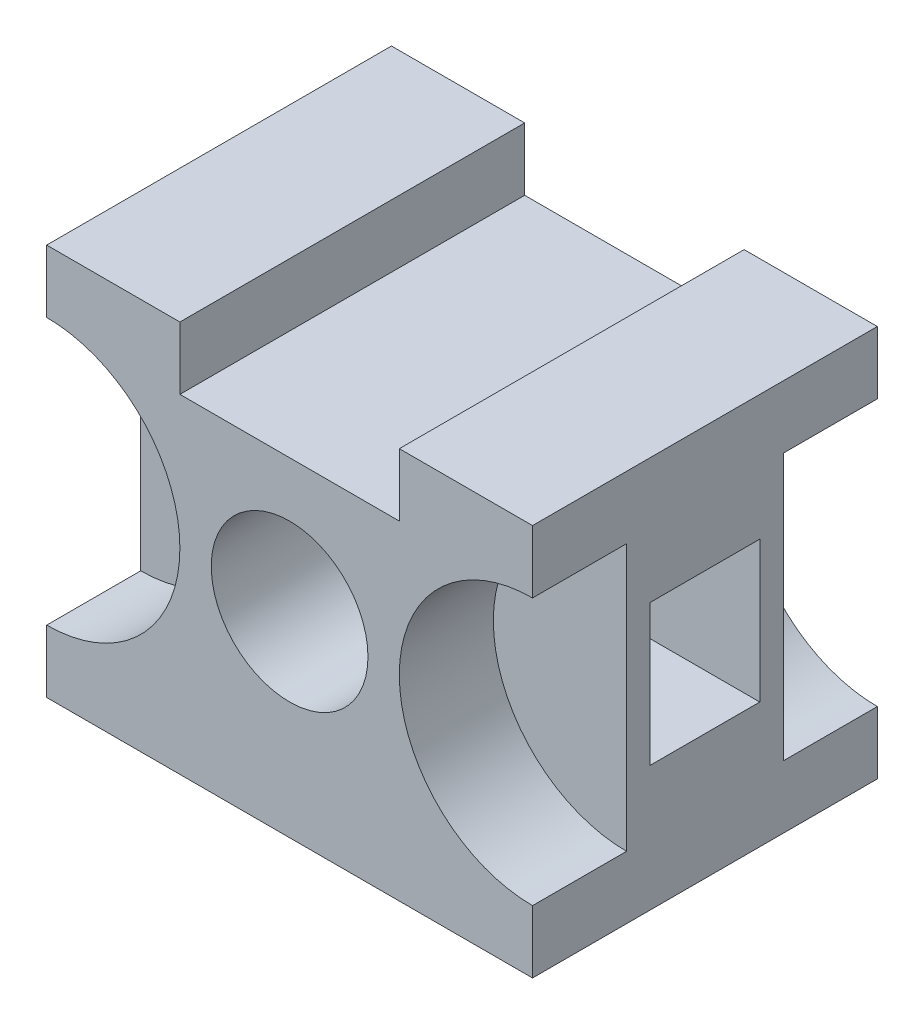
ISO-10303-21;
HEADER;
FILE_DESCRIPTION(('STEP AP214'),'2;1');
FILE_NAME('part.step','',(''),(''),'','','');
FILE_SCHEMA(('AUTOMOTIVE_DESIGN { 1 0 10303 214 1 1 1 1 }'));
ENDSEC;
DATA;
#1=APPLICATION_CONTEXT('core data for automotive mechanical design processes');
#2=APPLICATION_PROTOCOL_DEFINITION('international standard','automotive_design',2000,#1);
#3=PRODUCT_CONTEXT('',#1,'mechanical');
#4=PRODUCT('Part','Part','',(#3));
#5=PRODUCT_RELATED_PRODUCT_CATEGORY('part','',(#4));
#6=PRODUCT_DEFINITION_FORMATION('','',#4);
#7=PRODUCT_DEFINITION_CONTEXT('part definition',#1,'design');
#8=PRODUCT_DEFINITION('design','',#6,#7);
#9=PRODUCT_DEFINITION_SHAPE('','',#8);
#10=(LENGTH_UNIT() NAMED_UNIT(*) SI_UNIT(.MILLI.,.METRE.));
#11=(NAMED_UNIT(*) PLANE_ANGLE_UNIT() SI_UNIT($,.RADIAN.));
#12=(NAMED_UNIT(*) SI_UNIT($,.STERADIAN.) SOLID_ANGLE_UNIT());
#13=UNCERTAINTY_MEASURE_WITH_UNIT(LENGTH_MEASURE(1.E-05),#10,'distance_accuracy_value','');
#14=(GEOMETRIC_REPRESENTATION_CONTEXT(3) GLOBAL_UNCERTAINTY_ASSIGNED_CONTEXT((#13)) GLOBAL_UNIT_ASSIGNED_CONTEXT((#10,
#11,#12)) REPRESENTATION_CONTEXT('',''));
#15=CARTESIAN_POINT('',(0.,0.,0.));
#16=DIRECTION('',(0.,0.,1.));
#17=DIRECTION('',(1.,0.,0.));
#18=AXIS2_PLACEMENT_3D('',#15,#16,#17);
#19=CARTESIAN_POINT('',(0.,50.,-44.));
#20=DIRECTION('',(0.,1.,0.));
#21=DIRECTION('',(0.,0.,1.));
#22=AXIS2_PLACEMENT_3D('',#19,#20,#21);
#23=PLANE('',#22);
#24=DIRECTION('',(-1.,0.,0.));
#25=VECTOR('',#24,1.);
#26=CARTESIAN_POINT('',(0.,50.,-44.));
#27=LINE('',#26,#25);
#28=CARTESIAN_POINT('',(62.,50.,-44.));
#29=VERTEX_POINT('',#28);
#30=CARTESIAN_POINT('',(45.,50.,-44.));
#31=VERTEX_POINT('',#30);
#32=EDGE_CURVE('E387',#29,#31,#27,.T.);
#33=ORIENTED_EDGE('',*,*,#32,.T.);
#34=DIRECTION('',(0.,0.,1.));
#35=VECTOR('',#34,1.);
#36=CARTESIAN_POINT('',(45.,50.,-71.));
#37=LINE('',#36,#35);
#38=CARTESIAN_POINT('',(45.,50.,0.));
#39=VERTEX_POINT('',#38);
#40=EDGE_CURVE('E272',#31,#39,#37,.T.);
#41=ORIENTED_EDGE('',*,*,#40,.T.);
#42=DIRECTION('',(-1.,0.,0.));
#43=VECTOR('',#42,1.);
#44=CARTESIAN_POINT('',(0.,50.,0.));
#45=LINE('',#44,#43);
#46=CARTESIAN_POINT('',(62.,50.,0.));
#47=VERTEX_POINT('',#46);
#48=EDGE_CURVE('E406',#47,#39,#45,.T.);
#49=ORIENTED_EDGE('',*,*,#48,.F.);
#50=DIRECTION('',(0.,0.,1.));
#51=VECTOR('',#50,1.);
#52=CARTESIAN_POINT('',(62.,50.,-44.));
#53=LINE('',#52,#51);
#54=EDGE_CURVE('E415',#29,#47,#53,.T.);
#55=ORIENTED_EDGE('',*,*,#54,.F.);
#56=EDGE_LOOP('',(#33,#41,#49,#55));
#57=FACE_BOUND('',#56,.T.);
#58=ADVANCED_FACE('F43',(#57),#23,.T.);
#59=CARTESIAN_POINT('',(0.,0.,-44.));
#60=DIRECTION('',(0.,0.,-1.));
#61=DIRECTION('',(-1.,0.,0.));
#62=AXIS2_PLACEMENT_3D('',#59,#60,#61);
#63=PLANE('',#62);
#64=CARTESIAN_POINT('',(31.,25.,-44.));
#65=DIRECTION('',(0.,0.,-1.));
#66=DIRECTION('',(-1.,0.,0.));
#67=AXIS2_PLACEMENT_3D('',#64,#65,#66);
#68=CIRCLE('',#67,10.);
#69=CARTESIAN_POINT('',(21.,25.,-44.));
#70=VERTEX_POINT('',#69);
#71=EDGE_CURVE('E367',#70,#70,#68,.T.);
#72=ORIENTED_EDGE('',*,*,#71,.F.);
#73=EDGE_LOOP('',(#72));
#74=FACE_BOUND('',#73,.T.);
#75=DIRECTION('',(-1.,0.,0.));
#76=VECTOR('',#75,1.);
#77=CARTESIAN_POINT('',(0.,42.,-44.));
#78=LINE('',#77,#76);
#79=CARTESIAN_POINT('',(45.,42.,-44.));
#80=VERTEX_POINT('',#79);
#81=CARTESIAN_POINT('',(17.,42.,-44.));
#82=VERTEX_POINT('',#81);
#83=EDGE_CURVE('E288',#80,#82,#78,.T.);
#84=ORIENTED_EDGE('',*,*,#83,.F.);
#85=DIRECTION('',(0.,1.,0.));
#86=VECTOR('',#85,1.);
#87=CARTESIAN_POINT('',(45.,0.,-44.));
#88=LINE('',#87,#86);
#89=EDGE_CURVE('E291',#80,#31,#88,.T.);
#90=ORIENTED_EDGE('',*,*,#89,.T.);
#91=ORIENTED_EDGE('',*,*,#32,.F.);
#92=DIRECTION('',(0.,1.,0.));
#93=VECTOR('',#92,1.);
#94=CARTESIAN_POINT('',(62.,0.,-44.));
#95=LINE('',#94,#93);
#96=CARTESIAN_POINT('',(62.,42.,-44.));
#97=VERTEX_POINT('',#96);
#98=EDGE_CURVE('E381',#97,#29,#95,.T.);
#99=ORIENTED_EDGE('',*,*,#98,.F.);
#100=CARTESIAN_POINT('',(62.,25.,-44.));
#101=DIRECTION('',(0.,0.,-1.));
#102=DIRECTION('',(-1.,0.,0.));
#103=AXIS2_PLACEMENT_3D('',#100,#101,#102);
#104=CIRCLE('',#103,17.);
#105=CARTESIAN_POINT('',(62.,8.,-44.));
#106=VERTEX_POINT('',#105);
#107=EDGE_CURVE('E300',#106,#97,#104,.T.);
#108=ORIENTED_EDGE('',*,*,#107,.F.);
#109=CARTESIAN_POINT('',(62.,0.,-44.));
#110=VERTEX_POINT('',#109);
#111=EDGE_CURVE('E382',#110,#106,#95,.T.);
#112=ORIENTED_EDGE('',*,*,#111,.F.);
#113=DIRECTION('',(1.,0.,0.));
#114=VECTOR('',#113,1.);
#115=CARTESIAN_POINT('',(0.,0.,-44.));
#116=LINE('',#115,#114);
#117=CARTESIAN_POINT('',(0.,0.,-44.));
#118=VERTEX_POINT('',#117);
#119=EDGE_CURVE('E376',#118,#110,#116,.T.);
#120=ORIENTED_EDGE('',*,*,#119,.F.);
#121=DIRECTION('',(0.,-1.,0.));
#122=VECTOR('',#121,1.);
#123=CARTESIAN_POINT('',(0.,0.,-44.));
#124=LINE('',#123,#122);
#125=CARTESIAN_POINT('',(0.,8.,-44.));
#126=VERTEX_POINT('',#125);
#127=EDGE_CURVE('E377',#126,#118,#124,.T.);
#128=ORIENTED_EDGE('',*,*,#127,.F.);
#129=CARTESIAN_POINT('',(0.,25.,-44.));
#130=DIRECTION('',(0.,0.,-1.));
#131=DIRECTION('',(-1.,0.,0.));
#132=AXIS2_PLACEMENT_3D('',#129,#130,#131);
#133=CIRCLE('',#132,17.);
#134=CARTESIAN_POINT('',(0.,42.,-44.));
#135=VERTEX_POINT('',#134);
#136=EDGE_CURVE('E295',#135,#126,#133,.T.);
#137=ORIENTED_EDGE('',*,*,#136,.F.);
#138=CARTESIAN_POINT('',(0.,50.,-44.));
#139=VERTEX_POINT('',#138);
#140=EDGE_CURVE('E372',#139,#135,#124,.T.);
#141=ORIENTED_EDGE('',*,*,#140,.F.);
#142=CARTESIAN_POINT('',(17.,50.,-44.));
#143=VERTEX_POINT('',#142);
#144=EDGE_CURVE('E386',#143,#139,#27,.T.);
#145=ORIENTED_EDGE('',*,*,#144,.F.);
#146=DIRECTION('',(0.,1.,0.));
#147=VECTOR('',#146,1.);
#148=CARTESIAN_POINT('',(17.,0.,-44.));
#149=LINE('',#148,#147);
#150=EDGE_CURVE('E276',#82,#143,#149,.T.);
#151=ORIENTED_EDGE('',*,*,#150,.F.);
#152=EDGE_LOOP('',(#84,#90,#91,#99,#108,#112,#120,#128,#137,#141,#145,#151));
#153=FACE_BOUND('',#152,.T.);
#154=ADVANCED_FACE('F464',(#74,#153),#63,.T.);
#155=CARTESIAN_POINT('',(0.,0.,0.));
#156=DIRECTION('',(0.,0.,-1.));
#157=DIRECTION('',(-1.,0.,0.));
#158=AXIS2_PLACEMENT_3D('',#155,#156,#157);
#159=PLANE('',#158);
#160=CARTESIAN_POINT('',(31.,25.,0.));
#161=DIRECTION('',(0.,0.,1.));
#162=DIRECTION('',(1.,0.,0.));
#163=AXIS2_PLACEMENT_3D('',#160,#161,#162);
#164=CIRCLE('',#163,10.);
#165=CARTESIAN_POINT('',(41.,25.,0.));
#166=VERTEX_POINT('',#165);
#167=EDGE_CURVE('E346',#166,#166,#164,.T.);
#168=ORIENTED_EDGE('',*,*,#167,.F.);
#169=EDGE_LOOP('',(#168));
#170=FACE_BOUND('',#169,.T.);
#171=DIRECTION('',(0.,-1.,0.));
#172=VECTOR('',#171,1.);
#173=CARTESIAN_POINT('',(45.,0.,0.));
#174=LINE('',#173,#172);
#175=CARTESIAN_POINT('',(45.,42.,0.));
#176=VERTEX_POINT('',#175);
#177=EDGE_CURVE('E260',#39,#176,#174,.T.);
#178=ORIENTED_EDGE('',*,*,#177,.T.);
#179=DIRECTION('',(1.,0.,0.));
#180=VECTOR('',#179,1.);
#181=CARTESIAN_POINT('',(0.,42.,0.));
#182=LINE('',#181,#180);
#183=CARTESIAN_POINT('',(17.,42.,0.));
#184=VERTEX_POINT('',#183);
#185=EDGE_CURVE('E268',#184,#176,#182,.T.);
#186=ORIENTED_EDGE('',*,*,#185,.F.);
#187=DIRECTION('',(0.,-1.,0.));
#188=VECTOR('',#187,1.);
#189=CARTESIAN_POINT('',(17.,0.,0.));
#190=LINE('',#189,#188);
#191=CARTESIAN_POINT('',(17.,50.,0.));
#192=VERTEX_POINT('',#191);
#193=EDGE_CURVE('E264',#192,#184,#190,.T.);
#194=ORIENTED_EDGE('',*,*,#193,.F.);
#195=CARTESIAN_POINT('',(0.,50.,0.));
#196=VERTEX_POINT('',#195);
#197=EDGE_CURVE('E405',#192,#196,#45,.T.);
#198=ORIENTED_EDGE('',*,*,#197,.T.);
#199=DIRECTION('',(0.,-1.,0.));
#200=VECTOR('',#199,1.);
#201=CARTESIAN_POINT('',(0.,0.,0.));
#202=LINE('',#201,#200);
#203=CARTESIAN_POINT('',(0.,42.,0.));
#204=VERTEX_POINT('',#203);
#205=EDGE_CURVE('E392',#196,#204,#202,.T.);
#206=ORIENTED_EDGE('',*,*,#205,.T.);
#207=CARTESIAN_POINT('',(0.,25.,0.));
#208=DIRECTION('',(0.,0.,1.));
#209=DIRECTION('',(1.,0.,0.));
#210=AXIS2_PLACEMENT_3D('',#207,#208,#209);
#211=CIRCLE('',#210,17.);
#212=CARTESIAN_POINT('',(0.,8.,0.));
#213=VERTEX_POINT('',#212);
#214=EDGE_CURVE('E334',#213,#204,#211,.T.);
#215=ORIENTED_EDGE('',*,*,#214,.F.);
#216=CARTESIAN_POINT('',(0.,0.,0.));
#217=VERTEX_POINT('',#216);
#218=EDGE_CURVE('E371',#213,#217,#202,.T.);
#219=ORIENTED_EDGE('',*,*,#218,.T.);
#220=DIRECTION('',(1.,0.,0.));
#221=VECTOR('',#220,1.);
#222=CARTESIAN_POINT('',(0.,0.,0.));
#223=LINE('',#222,#221);
#224=CARTESIAN_POINT('',(62.,0.,0.));
#225=VERTEX_POINT('',#224);
#226=EDGE_CURVE('E396',#217,#225,#223,.T.);
#227=ORIENTED_EDGE('',*,*,#226,.T.);
#228=DIRECTION('',(0.,1.,0.));
#229=VECTOR('',#228,1.);
#230=CARTESIAN_POINT('',(62.,0.,0.));
#231=LINE('',#230,#229);
#232=CARTESIAN_POINT('',(62.,8.00000000000001,0.));
#233=VERTEX_POINT('',#232);
#234=EDGE_CURVE('E401',#225,#233,#231,.T.);
#235=ORIENTED_EDGE('',*,*,#234,.T.);
#236=CARTESIAN_POINT('',(62.,25.,0.));
#237=DIRECTION('',(0.,0.,1.));
#238=DIRECTION('',(1.,0.,0.));
#239=AXIS2_PLACEMENT_3D('',#236,#237,#238);
#240=CIRCLE('',#239,17.);
#241=CARTESIAN_POINT('',(62.,42.,0.));
#242=VERTEX_POINT('',#241);
#243=EDGE_CURVE('E312',#242,#233,#240,.T.);
#244=ORIENTED_EDGE('',*,*,#243,.F.);
#245=EDGE_CURVE('E400',#242,#47,#231,.T.);
#246=ORIENTED_EDGE('',*,*,#245,.T.);
#247=ORIENTED_EDGE('',*,*,#48,.T.);
#248=EDGE_LOOP('',(#178,#186,#194,#198,#206,#215,#219,#227,#235,#244,#246,#247));
#249=FACE_BOUND('',#248,.T.);
#250=ADVANCED_FACE('F471',(#170,#249),#159,.F.);
#251=CARTESIAN_POINT('',(0.,0.,-44.));
#252=DIRECTION('',(-1.,0.,0.));
#253=DIRECTION('',(0.,0.,1.));
#254=AXIS2_PLACEMENT_3D('',#251,#252,#253);
#255=PLANE('',#254);
#256=DIRECTION('',(0.,0.,1.));
#257=VECTOR('',#256,1.);
#258=CARTESIAN_POINT('',(0.,16.,-29.));
#259=LINE('',#258,#257);
#260=CARTESIAN_POINT('',(0.,16.,-29.));
#261=VERTEX_POINT('',#260);
#262=CARTESIAN_POINT('',(0.,16.,-15.));
#263=VERTEX_POINT('',#262);
#264=EDGE_CURVE('E59',#261,#263,#259,.T.);
#265=ORIENTED_EDGE('',*,*,#264,.F.);
#266=DIRECTION('',(0.,-1.,0.));
#267=VECTOR('',#266,1.);
#268=CARTESIAN_POINT('',(0.,34.,-29.));
#269=LINE('',#268,#267);
#270=CARTESIAN_POINT('',(0.,34.,-29.));
#271=VERTEX_POINT('',#270);
#272=EDGE_CURVE('E229',#271,#261,#269,.T.);
#273=ORIENTED_EDGE('',*,*,#272,.F.);
#274=DIRECTION('',(0.,0.,1.));
#275=VECTOR('',#274,1.);
#276=CARTESIAN_POINT('',(0.,34.,-29.));
#277=LINE('',#276,#275);
#278=CARTESIAN_POINT('',(0.,34.,-15.));
#279=VERTEX_POINT('',#278);
#280=EDGE_CURVE('E211',#271,#279,#277,.T.);
#281=ORIENTED_EDGE('',*,*,#280,.T.);
#282=DIRECTION('',(0.,-1.,0.));
#283=VECTOR('',#282,1.);
#284=CARTESIAN_POINT('',(0.,34.,-15.));
#285=LINE('',#284,#283);
#286=EDGE_CURVE('E221',#279,#263,#285,.T.);
#287=ORIENTED_EDGE('',*,*,#286,.T.);
#288=EDGE_LOOP('',(#265,#273,#281,#287));
#289=FACE_BOUND('',#288,.T.);
#290=DIRECTION('',(0.,0.,-1.));
#291=VECTOR('',#290,1.);
#292=CARTESIAN_POINT('',(0.,42.,-32.));
#293=LINE('',#292,#291);
#294=CARTESIAN_POINT('',(0.,42.,-32.));
#295=VERTEX_POINT('',#294);
#296=EDGE_CURVE('E322',#295,#135,#293,.T.);
#297=ORIENTED_EDGE('',*,*,#296,.F.);
#298=DIRECTION('',(0.,1.,0.));
#299=VECTOR('',#298,1.);
#300=CARTESIAN_POINT('',(0.,0.,-32.));
#301=LINE('',#300,#299);
#302=CARTESIAN_POINT('',(0.,8.,-32.));
#303=VERTEX_POINT('',#302);
#304=EDGE_CURVE('E315',#303,#295,#301,.T.);
#305=ORIENTED_EDGE('',*,*,#304,.F.);
#306=DIRECTION('',(0.,0.,-1.));
#307=VECTOR('',#306,1.);
#308=CARTESIAN_POINT('',(0.,8.,-32.));
#309=LINE('',#308,#307);
#310=EDGE_CURVE('E307',#303,#126,#309,.T.);
#311=ORIENTED_EDGE('',*,*,#310,.T.);
#312=ORIENTED_EDGE('',*,*,#127,.T.);
#313=DIRECTION('',(0.,0.,1.));
#314=VECTOR('',#313,1.);
#315=CARTESIAN_POINT('',(0.,0.,-44.));
#316=LINE('',#315,#314);
#317=EDGE_CURVE('E391',#118,#217,#316,.T.);
#318=ORIENTED_EDGE('',*,*,#317,.T.);
#319=ORIENTED_EDGE('',*,*,#218,.F.);
#320=DIRECTION('',(0.,0.,1.));
#321=VECTOR('',#320,1.);
#322=CARTESIAN_POINT('',(0.,8.,-12.));
#323=LINE('',#322,#321);
#324=CARTESIAN_POINT('',(0.,8.,-12.));
#325=VERTEX_POINT('',#324);
#326=EDGE_CURVE('E338',#325,#213,#323,.T.);
#327=ORIENTED_EDGE('',*,*,#326,.F.);
#328=DIRECTION('',(0.,-1.,0.));
#329=VECTOR('',#328,1.);
#330=CARTESIAN_POINT('',(0.,0.,-12.));
#331=LINE('',#330,#329);
#332=CARTESIAN_POINT('',(0.,42.,-12.));
#333=VERTEX_POINT('',#332);
#334=EDGE_CURVE('E330',#333,#325,#331,.T.);
#335=ORIENTED_EDGE('',*,*,#334,.F.);
#336=DIRECTION('',(0.,0.,1.));
#337=VECTOR('',#336,1.);
#338=CARTESIAN_POINT('',(0.,42.,-12.));
#339=LINE('',#338,#337);
#340=EDGE_CURVE('E342',#333,#204,#339,.T.);
#341=ORIENTED_EDGE('',*,*,#340,.T.);
#342=ORIENTED_EDGE('',*,*,#205,.F.);
#343=DIRECTION('',(0.,0.,1.));
#344=VECTOR('',#343,1.);
#345=CARTESIAN_POINT('',(0.,50.,-44.));
#346=LINE('',#345,#344);
#347=EDGE_CURVE('E410',#139,#196,#346,.T.);
#348=ORIENTED_EDGE('',*,*,#347,.F.);
#349=ORIENTED_EDGE('',*,*,#140,.T.);
#350=EDGE_LOOP('',(#297,#305,#311,#312,#318,#319,#327,#335,#341,#342,#348,#349));
#351=FACE_BOUND('',#350,.T.);
#352=ADVANCED_FACE('F45',(#289,#351),#255,.T.);
#353=DIRECTION('',(0.,0.,1.));
#354=VECTOR('',#353,1.);
#355=CARTESIAN_POINT('',(17.,50.,-71.));
#356=LINE('',#355,#354);
#357=EDGE_CURVE('E280',#143,#192,#356,.T.);
#358=ORIENTED_EDGE('',*,*,#357,.F.);
#359=ORIENTED_EDGE('',*,*,#144,.T.);
#360=ORIENTED_EDGE('',*,*,#347,.T.);
#361=ORIENTED_EDGE('',*,*,#197,.F.);
#362=EDGE_LOOP('',(#358,#359,#360,#361));
#363=FACE_BOUND('',#362,.T.);
#364=ADVANCED_FACE('F467',(#363),#23,.T.);
#365=CARTESIAN_POINT('',(62.,0.,-44.));
#366=DIRECTION('',(1.,0.,0.));
#367=DIRECTION('',(0.,0.,-1.));
#368=AXIS2_PLACEMENT_3D('',#365,#366,#367);
#369=PLANE('',#368);
#370=DIRECTION('',(0.,0.,-1.));
#371=VECTOR('',#370,1.);
#372=CARTESIAN_POINT('',(62.,16.,-44.));
#373=LINE('',#372,#371);
#374=CARTESIAN_POINT('',(62.,16.,-15.));
#375=VERTEX_POINT('',#374);
#376=CARTESIAN_POINT('',(62.,16.,-29.));
#377=VERTEX_POINT('',#376);
#378=EDGE_CURVE('E257',#375,#377,#373,.T.);
#379=ORIENTED_EDGE('',*,*,#378,.F.);
#380=DIRECTION('',(0.,1.,0.));
#381=VECTOR('',#380,1.);
#382=CARTESIAN_POINT('',(62.,0.,-15.));
#383=LINE('',#382,#381);
#384=CARTESIAN_POINT('',(62.,34.,-15.));
#385=VERTEX_POINT('',#384);
#386=EDGE_CURVE('E246',#375,#385,#383,.T.);
#387=ORIENTED_EDGE('',*,*,#386,.T.);
#388=DIRECTION('',(0.,0.,-1.));
#389=VECTOR('',#388,1.);
#390=CARTESIAN_POINT('',(62.,34.,-44.));
#391=LINE('',#390,#389);
#392=CARTESIAN_POINT('',(62.,34.,-29.));
#393=VERTEX_POINT('',#392);
#394=EDGE_CURVE('E250',#385,#393,#391,.T.);
#395=ORIENTED_EDGE('',*,*,#394,.T.);
#396=DIRECTION('',(0.,1.,0.));
#397=VECTOR('',#396,1.);
#398=CARTESIAN_POINT('',(62.,0.,-29.));
#399=LINE('',#398,#397);
#400=EDGE_CURVE('E254',#377,#393,#399,.T.);
#401=ORIENTED_EDGE('',*,*,#400,.F.);
#402=EDGE_LOOP('',(#379,#387,#395,#401));
#403=FACE_BOUND('',#402,.T.);
#404=DIRECTION('',(0.,0.,-1.));
#405=VECTOR('',#404,1.);
#406=CARTESIAN_POINT('',(62.,8.,-32.));
#407=LINE('',#406,#405);
#408=CARTESIAN_POINT('',(62.,8.,-32.));
#409=VERTEX_POINT('',#408);
#410=EDGE_CURVE('E304',#409,#106,#407,.T.);
#411=ORIENTED_EDGE('',*,*,#410,.F.);
#412=DIRECTION('',(0.,-1.,0.));
#413=VECTOR('',#412,1.);
#414=CARTESIAN_POINT('',(62.,0.,-32.));
#415=LINE('',#414,#413);
#416=CARTESIAN_POINT('',(62.,42.,-32.));
#417=VERTEX_POINT('',#416);
#418=EDGE_CURVE('E296',#417,#409,#415,.T.);
#419=ORIENTED_EDGE('',*,*,#418,.F.);
#420=DIRECTION('',(0.,0.,-1.));
#421=VECTOR('',#420,1.);
#422=CARTESIAN_POINT('',(62.,42.,-32.));
#423=LINE('',#422,#421);
#424=EDGE_CURVE('E308',#417,#97,#423,.T.);
#425=ORIENTED_EDGE('',*,*,#424,.T.);
#426=ORIENTED_EDGE('',*,*,#98,.T.);
#427=ORIENTED_EDGE('',*,*,#54,.T.);
#428=ORIENTED_EDGE('',*,*,#245,.F.);
#429=DIRECTION('',(0.,0.,1.));
#430=VECTOR('',#429,1.);
#431=CARTESIAN_POINT('',(62.,42.,-12.));
#432=LINE('',#431,#430);
#433=CARTESIAN_POINT('',(62.,42.,-12.));
#434=VERTEX_POINT('',#433);
#435=EDGE_CURVE('E356',#434,#242,#432,.T.);
#436=ORIENTED_EDGE('',*,*,#435,.F.);
#437=DIRECTION('',(0.,1.,0.));
#438=VECTOR('',#437,1.);
#439=CARTESIAN_POINT('',(62.,0.,-12.));
#440=LINE('',#439,#438);
#441=CARTESIAN_POINT('',(62.,8.00000000000001,-12.));
#442=VERTEX_POINT('',#441);
#443=EDGE_CURVE('E349',#442,#434,#440,.T.);
#444=ORIENTED_EDGE('',*,*,#443,.F.);
#445=DIRECTION('',(0.,0.,1.));
#446=VECTOR('',#445,1.);
#447=CARTESIAN_POINT('',(62.,8.00000000000001,-12.));
#448=LINE('',#447,#446);
#449=EDGE_CURVE('E341',#442,#233,#448,.T.);
#450=ORIENTED_EDGE('',*,*,#449,.T.);
#451=ORIENTED_EDGE('',*,*,#234,.F.);
#452=DIRECTION('',(0.,0.,1.));
#453=VECTOR('',#452,1.);
#454=CARTESIAN_POINT('',(62.,0.,-44.));
#455=LINE('',#454,#453);
#456=EDGE_CURVE('E419',#110,#225,#455,.T.);
#457=ORIENTED_EDGE('',*,*,#456,.F.);
#458=ORIENTED_EDGE('',*,*,#111,.T.);
#459=EDGE_LOOP('',(#411,#419,#425,#426,#427,#428,#436,#444,#450,#451,#457,#458));
#460=FACE_BOUND('',#459,.T.);
#461=ADVANCED_FACE('F477',(#403,#460),#369,.T.);
#462=CARTESIAN_POINT('',(0.,0.,-44.));
#463=DIRECTION('',(0.,-1.,0.));
#464=DIRECTION('',(0.,0.,-1.));
#465=AXIS2_PLACEMENT_3D('',#462,#463,#464);
#466=PLANE('',#465);
#467=ORIENTED_EDGE('',*,*,#226,.F.);
#468=ORIENTED_EDGE('',*,*,#317,.F.);
#469=ORIENTED_EDGE('',*,*,#119,.T.);
#470=ORIENTED_EDGE('',*,*,#456,.T.);
#471=EDGE_LOOP('',(#467,#468,#469,#470));
#472=FACE_BOUND('',#471,.T.);
#473=ADVANCED_FACE('F483',(#472),#466,.T.);
#474=CARTESIAN_POINT('',(31.,25.,-56.));
#475=DIRECTION('',(0.,0.,1.));
#476=DIRECTION('',(1.,0.,0.));
#477=AXIS2_PLACEMENT_3D('',#474,#475,#476);
#478=CYLINDRICAL_SURFACE('',#477,10.);
#479=CARTESIAN_POINT('',(31.,25.,-29.));
#480=DIRECTION('',(0.,0.,-1.));
#481=DIRECTION('',(0.,1.,0.));
#482=AXIS2_PLACEMENT_3D('',#479,#480,#481);
#483=CIRCLE('',#482,10.);
#484=CARTESIAN_POINT('',(26.6411010564593,34.,-29.));
#485=VERTEX_POINT('',#484);
#486=CARTESIAN_POINT('',(26.6411010564593,16.,-29.));
#487=VERTEX_POINT('',#486);
#488=EDGE_CURVE('E52',#485,#487,#483,.F.);
#489=ORIENTED_EDGE('',*,*,#488,.T.);
#490=DIRECTION('',(0.,0.,1.));
#491=VECTOR('',#490,1.);
#492=CARTESIAN_POINT('',(26.6411010564593,16.,-56.));
#493=LINE('',#492,#491);
#494=CARTESIAN_POINT('',(26.6411010564593,16.,-15.));
#495=VERTEX_POINT('',#494);
#496=EDGE_CURVE('E11',#487,#495,#493,.T.);
#497=ORIENTED_EDGE('',*,*,#496,.T.);
#498=CARTESIAN_POINT('',(31.,25.,-15.));
#499=DIRECTION('',(0.,0.,-1.));
#500=DIRECTION('',(0.,1.,0.));
#501=AXIS2_PLACEMENT_3D('',#498,#499,#500);
#502=CIRCLE('',#501,10.);
#503=CARTESIAN_POINT('',(26.6411010564593,34.,-15.));
#504=VERTEX_POINT('',#503);
#505=EDGE_CURVE('E428',#504,#495,#502,.F.);
#506=ORIENTED_EDGE('',*,*,#505,.F.);
#507=DIRECTION('',(0.,0.,1.));
#508=VECTOR('',#507,1.);
#509=CARTESIAN_POINT('',(26.6411010564593,34.,-56.));
#510=LINE('',#509,#508);
#511=EDGE_CURVE('E214',#485,#504,#510,.T.);
#512=ORIENTED_EDGE('',*,*,#511,.F.);
#513=EDGE_LOOP('',(#489,#497,#506,#512));
#514=FACE_BOUND('',#513,.T.);
#515=CARTESIAN_POINT('',(35.3588989435407,16.,-15.));
#516=VERTEX_POINT('',#515);
#517=CARTESIAN_POINT('',(35.3588989435407,34.,-15.));
#518=VERTEX_POINT('',#517);
#519=EDGE_CURVE('E414',#516,#518,#502,.F.);
#520=ORIENTED_EDGE('',*,*,#519,.F.);
#521=DIRECTION('',(0.,0.,1.));
#522=VECTOR('',#521,1.);
#523=CARTESIAN_POINT('',(35.3588989435407,16.,-56.));
#524=LINE('',#523,#522);
#525=CARTESIAN_POINT('',(35.3588989435407,16.,-29.));
#526=VERTEX_POINT('',#525);
#527=EDGE_CURVE('E435',#516,#526,#524,.F.);
#528=ORIENTED_EDGE('',*,*,#527,.T.);
#529=CARTESIAN_POINT('',(35.3588989435407,34.,-29.));
#530=VERTEX_POINT('',#529);
#531=EDGE_CURVE('E431',#526,#530,#483,.F.);
#532=ORIENTED_EDGE('',*,*,#531,.T.);
#533=DIRECTION('',(0.,0.,1.));
#534=VECTOR('',#533,1.);
#535=CARTESIAN_POINT('',(35.3588989435407,34.,-56.));
#536=LINE('',#535,#534);
#537=EDGE_CURVE('E427',#518,#530,#536,.F.);
#538=ORIENTED_EDGE('',*,*,#537,.F.);
#539=EDGE_LOOP('',(#520,#528,#532,#538));
#540=FACE_BOUND('',#539,.T.);
#541=ORIENTED_EDGE('',*,*,#71,.T.);
#542=EDGE_LOOP('',(#541));
#543=FACE_BOUND('',#542,.T.);
#544=ORIENTED_EDGE('',*,*,#167,.T.);
#545=EDGE_LOOP('',(#544));
#546=FACE_BOUND('',#545,.T.);
#547=ADVANCED_FACE('F445',(#514,#540,#543,#546),#478,.F.);
#548=CARTESIAN_POINT('',(62.,25.,-12.));
#549=DIRECTION('',(0.,0.,1.));
#550=DIRECTION('',(1.,0.,0.));
#551=AXIS2_PLACEMENT_3D('',#548,#549,#550);
#552=CYLINDRICAL_SURFACE('',#551,17.);
#553=ORIENTED_EDGE('',*,*,#243,.T.);
#554=ORIENTED_EDGE('',*,*,#449,.F.);
#555=CARTESIAN_POINT('',(62.,25.,-12.));
#556=DIRECTION('',(0.,0.,1.));
#557=DIRECTION('',(1.,0.,0.));
#558=AXIS2_PLACEMENT_3D('',#555,#556,#557);
#559=CIRCLE('',#558,17.);
#560=EDGE_CURVE('E352',#434,#442,#559,.T.);
#561=ORIENTED_EDGE('',*,*,#560,.F.);
#562=ORIENTED_EDGE('',*,*,#435,.T.);
#563=EDGE_LOOP('',(#553,#554,#561,#562));
#564=FACE_BOUND('',#563,.T.);
#565=ADVANCED_FACE('F541',(#564),#552,.F.);
#566=CARTESIAN_POINT('',(0.,0.,-12.));
#567=DIRECTION('',(0.,0.,1.));
#568=DIRECTION('',(1.,0.,0.));
#569=AXIS2_PLACEMENT_3D('',#566,#567,#568);
#570=PLANE('',#569);
#571=ORIENTED_EDGE('',*,*,#443,.T.);
#572=ORIENTED_EDGE('',*,*,#560,.T.);
#573=EDGE_LOOP('',(#571,#572));
#574=FACE_BOUND('',#573,.T.);
#575=ADVANCED_FACE('F543',(#574),#570,.T.);
#576=CARTESIAN_POINT('',(0.,25.,-12.));
#577=DIRECTION('',(0.,0.,1.));
#578=DIRECTION('',(1.,0.,0.));
#579=AXIS2_PLACEMENT_3D('',#576,#577,#578);
#580=CYLINDRICAL_SURFACE('',#579,17.);
#581=ORIENTED_EDGE('',*,*,#214,.T.);
#582=ORIENTED_EDGE('',*,*,#340,.F.);
#583=CARTESIAN_POINT('',(0.,25.,-12.));
#584=DIRECTION('',(0.,0.,1.));
#585=DIRECTION('',(1.,0.,0.));
#586=AXIS2_PLACEMENT_3D('',#583,#584,#585);
#587=CIRCLE('',#586,17.);
#588=EDGE_CURVE('E333',#325,#333,#587,.T.);
#589=ORIENTED_EDGE('',*,*,#588,.F.);
#590=ORIENTED_EDGE('',*,*,#326,.T.);
#591=EDGE_LOOP('',(#581,#582,#589,#590));
#592=FACE_BOUND('',#591,.T.);
#593=ADVANCED_FACE('F545',(#592),#580,.F.);
#594=CARTESIAN_POINT('',(0.,0.,-12.));
#595=DIRECTION('',(0.,0.,1.));
#596=DIRECTION('',(1.,0.,0.));
#597=AXIS2_PLACEMENT_3D('',#594,#595,#596);
#598=PLANE('',#597);
#599=ORIENTED_EDGE('',*,*,#334,.T.);
#600=ORIENTED_EDGE('',*,*,#588,.T.);
#601=EDGE_LOOP('',(#599,#600));
#602=FACE_BOUND('',#601,.T.);
#603=ADVANCED_FACE('F551',(#602),#598,.T.);
#604=CARTESIAN_POINT('',(0.,25.,-32.));
#605=DIRECTION('',(0.,0.,-1.));
#606=DIRECTION('',(-1.,0.,0.));
#607=AXIS2_PLACEMENT_3D('',#604,#605,#606);
#608=CYLINDRICAL_SURFACE('',#607,17.);
#609=ORIENTED_EDGE('',*,*,#136,.T.);
#610=ORIENTED_EDGE('',*,*,#310,.F.);
#611=CARTESIAN_POINT('',(0.,25.,-32.));
#612=DIRECTION('',(0.,0.,-1.));
#613=DIRECTION('',(-1.,0.,0.));
#614=AXIS2_PLACEMENT_3D('',#611,#612,#613);
#615=CIRCLE('',#614,17.);
#616=EDGE_CURVE('E318',#295,#303,#615,.T.);
#617=ORIENTED_EDGE('',*,*,#616,.F.);
#618=ORIENTED_EDGE('',*,*,#296,.T.);
#619=EDGE_LOOP('',(#609,#610,#617,#618));
#620=FACE_BOUND('',#619,.T.);
#621=ADVANCED_FACE('F729',(#620),#608,.F.);
#622=CARTESIAN_POINT('',(0.,0.,-32.));
#623=DIRECTION('',(0.,0.,-1.));
#624=DIRECTION('',(-1.,0.,0.));
#625=AXIS2_PLACEMENT_3D('',#622,#623,#624);
#626=PLANE('',#625);
#627=ORIENTED_EDGE('',*,*,#304,.T.);
#628=ORIENTED_EDGE('',*,*,#616,.T.);
#629=EDGE_LOOP('',(#627,#628));
#630=FACE_BOUND('',#629,.T.);
#631=ADVANCED_FACE('F720',(#630),#626,.T.);
#632=CARTESIAN_POINT('',(62.,25.,-32.));
#633=DIRECTION('',(0.,0.,-1.));
#634=DIRECTION('',(-1.,0.,0.));
#635=AXIS2_PLACEMENT_3D('',#632,#633,#634);
#636=CYLINDRICAL_SURFACE('',#635,17.);
#637=ORIENTED_EDGE('',*,*,#107,.T.);
#638=ORIENTED_EDGE('',*,*,#424,.F.);
#639=CARTESIAN_POINT('',(62.,25.,-32.));
#640=DIRECTION('',(0.,0.,-1.));
#641=DIRECTION('',(-1.,0.,0.));
#642=AXIS2_PLACEMENT_3D('',#639,#640,#641);
#643=CIRCLE('',#642,17.);
#644=EDGE_CURVE('E299',#409,#417,#643,.T.);
#645=ORIENTED_EDGE('',*,*,#644,.F.);
#646=ORIENTED_EDGE('',*,*,#410,.T.);
#647=EDGE_LOOP('',(#637,#638,#645,#646));
#648=FACE_BOUND('',#647,.T.);
#649=ADVANCED_FACE('F527',(#648),#636,.F.);
#650=CARTESIAN_POINT('',(0.,0.,-32.));
#651=DIRECTION('',(0.,0.,-1.));
#652=DIRECTION('',(-1.,0.,0.));
#653=AXIS2_PLACEMENT_3D('',#650,#651,#652);
#654=PLANE('',#653);
#655=ORIENTED_EDGE('',*,*,#418,.T.);
#656=ORIENTED_EDGE('',*,*,#644,.T.);
#657=EDGE_LOOP('',(#655,#656));
#658=FACE_BOUND('',#657,.T.);
#659=ADVANCED_FACE('F686',(#658),#654,.T.);
#660=CARTESIAN_POINT('',(45.,0.,-71.));
#661=DIRECTION('',(-1.,0.,0.));
#662=DIRECTION('',(0.,0.,1.));
#663=AXIS2_PLACEMENT_3D('',#660,#661,#662);
#664=PLANE('',#663);
#665=DIRECTION('',(0.,0.,1.));
#666=VECTOR('',#665,1.);
#667=CARTESIAN_POINT('',(45.,42.,-71.));
#668=LINE('',#667,#666);
#669=EDGE_CURVE('E273',#80,#176,#668,.T.);
#670=ORIENTED_EDGE('',*,*,#669,.T.);
#671=ORIENTED_EDGE('',*,*,#177,.F.);
#672=ORIENTED_EDGE('',*,*,#40,.F.);
#673=ORIENTED_EDGE('',*,*,#89,.F.);
#674=EDGE_LOOP('',(#670,#671,#672,#673));
#675=FACE_BOUND('',#674,.T.);
#676=ADVANCED_FACE('F677',(#675),#664,.T.);
#677=CARTESIAN_POINT('',(0.,42.,-71.));
#678=DIRECTION('',(0.,-1.,0.));
#679=DIRECTION('',(1.,0.,0.));
#680=AXIS2_PLACEMENT_3D('',#677,#678,#679);
#681=PLANE('',#680);
#682=ORIENTED_EDGE('',*,*,#83,.T.);
#683=DIRECTION('',(0.,0.,1.));
#684=VECTOR('',#683,1.);
#685=CARTESIAN_POINT('',(17.,42.,-71.));
#686=LINE('',#685,#684);
#687=EDGE_CURVE('E277',#82,#184,#686,.T.);
#688=ORIENTED_EDGE('',*,*,#687,.T.);
#689=ORIENTED_EDGE('',*,*,#185,.T.);
#690=ORIENTED_EDGE('',*,*,#669,.F.);
#691=EDGE_LOOP('',(#682,#688,#689,#690));
#692=FACE_BOUND('',#691,.T.);
#693=ADVANCED_FACE('F669',(#692),#681,.F.);
#694=CARTESIAN_POINT('',(17.,0.,-71.));
#695=DIRECTION('',(-1.,0.,0.));
#696=DIRECTION('',(0.,0.,1.));
#697=AXIS2_PLACEMENT_3D('',#694,#695,#696);
#698=PLANE('',#697);
#699=ORIENTED_EDGE('',*,*,#150,.T.);
#700=ORIENTED_EDGE('',*,*,#357,.T.);
#701=ORIENTED_EDGE('',*,*,#193,.T.);
#702=ORIENTED_EDGE('',*,*,#687,.F.);
#703=EDGE_LOOP('',(#699,#700,#701,#702));
#704=FACE_BOUND('',#703,.T.);
#705=ADVANCED_FACE('F578',(#704),#698,.F.);
#706=CARTESIAN_POINT('',(71.,34.,-15.));
#707=DIRECTION('',(0.,0.,-1.));
#708=DIRECTION('',(0.,1.,0.));
#709=AXIS2_PLACEMENT_3D('',#706,#707,#708);
#710=PLANE('',#709);
#711=DIRECTION('',(-1.,0.,0.));
#712=VECTOR('',#711,1.);
#713=CARTESIAN_POINT('',(71.,16.,-15.));
#714=LINE('',#713,#712);
#715=EDGE_CURVE('E218',#375,#516,#714,.T.);
#716=ORIENTED_EDGE('',*,*,#715,.T.);
#717=ORIENTED_EDGE('',*,*,#519,.T.);
#718=DIRECTION('',(-1.,0.,0.));
#719=VECTOR('',#718,1.);
#720=CARTESIAN_POINT('',(71.,34.,-15.));
#721=LINE('',#720,#719);
#722=EDGE_CURVE('E67',#385,#518,#721,.T.);
#723=ORIENTED_EDGE('',*,*,#722,.F.);
#724=ORIENTED_EDGE('',*,*,#386,.F.);
#725=EDGE_LOOP('',(#716,#717,#723,#724));
#726=FACE_BOUND('',#725,.T.);
#727=ADVANCED_FACE('F510',(#726),#710,.T.);
#728=CARTESIAN_POINT('',(71.,34.,-29.));
#729=DIRECTION('',(0.,-1.,0.));
#730=DIRECTION('',(0.,0.,-1.));
#731=AXIS2_PLACEMENT_3D('',#728,#729,#730);
#732=PLANE('',#731);
#733=ORIENTED_EDGE('',*,*,#722,.T.);
#734=ORIENTED_EDGE('',*,*,#537,.T.);
#735=DIRECTION('',(-1.,0.,0.));
#736=VECTOR('',#735,1.);
#737=CARTESIAN_POINT('',(71.,34.,-29.));
#738=LINE('',#737,#736);
#739=EDGE_CURVE('E240',#393,#530,#738,.T.);
#740=ORIENTED_EDGE('',*,*,#739,.F.);
#741=ORIENTED_EDGE('',*,*,#394,.F.);
#742=EDGE_LOOP('',(#733,#734,#740,#741));
#743=FACE_BOUND('',#742,.T.);
#744=ADVANCED_FACE('F458',(#743),#732,.T.);
#745=CARTESIAN_POINT('',(71.,34.,-29.));
#746=DIRECTION('',(0.,0.,-1.));
#747=DIRECTION('',(0.,1.,0.));
#748=AXIS2_PLACEMENT_3D('',#745,#746,#747);
#749=PLANE('',#748);
#750=ORIENTED_EDGE('',*,*,#400,.T.);
#751=ORIENTED_EDGE('',*,*,#739,.T.);
#752=ORIENTED_EDGE('',*,*,#531,.F.);
#753=DIRECTION('',(-1.,0.,0.));
#754=VECTOR('',#753,1.);
#755=CARTESIAN_POINT('',(71.,16.,-29.));
#756=LINE('',#755,#754);
#757=EDGE_CURVE('E239',#377,#526,#756,.T.);
#758=ORIENTED_EDGE('',*,*,#757,.F.);
#759=EDGE_LOOP('',(#750,#751,#752,#758));
#760=FACE_BOUND('',#759,.T.);
#761=ADVANCED_FACE('F452',(#760),#749,.F.);
#762=CARTESIAN_POINT('',(71.,16.,-29.));
#763=DIRECTION('',(0.,-1.,0.));
#764=DIRECTION('',(0.,0.,-1.));
#765=AXIS2_PLACEMENT_3D('',#762,#763,#764);
#766=PLANE('',#765);
#767=ORIENTED_EDGE('',*,*,#378,.T.);
#768=ORIENTED_EDGE('',*,*,#757,.T.);
#769=ORIENTED_EDGE('',*,*,#527,.F.);
#770=ORIENTED_EDGE('',*,*,#715,.F.);
#771=EDGE_LOOP('',(#767,#768,#769,#770));
#772=FACE_BOUND('',#771,.T.);
#773=ADVANCED_FACE('F459',(#772),#766,.F.);
#774=EDGE_CURVE('E236',#487,#261,#756,.T.);
#775=ORIENTED_EDGE('',*,*,#774,.T.);
#776=ORIENTED_EDGE('',*,*,#264,.T.);
#777=EDGE_CURVE('E223',#495,#263,#714,.T.);
#778=ORIENTED_EDGE('',*,*,#777,.F.);
#779=ORIENTED_EDGE('',*,*,#496,.F.);
#780=EDGE_LOOP('',(#775,#776,#778,#779));
#781=FACE_BOUND('',#780,.T.);
#782=ADVANCED_FACE('F443',(#781),#766,.F.);
#783=EDGE_CURVE('E241',#485,#271,#738,.T.);
#784=ORIENTED_EDGE('',*,*,#783,.T.);
#785=ORIENTED_EDGE('',*,*,#272,.T.);
#786=ORIENTED_EDGE('',*,*,#774,.F.);
#787=ORIENTED_EDGE('',*,*,#488,.F.);
#788=EDGE_LOOP('',(#784,#785,#786,#787));
#789=FACE_BOUND('',#788,.T.);
#790=ADVANCED_FACE('F448',(#789),#749,.F.);
#791=ORIENTED_EDGE('',*,*,#511,.T.);
#792=EDGE_CURVE('E206',#504,#279,#721,.T.);
#793=ORIENTED_EDGE('',*,*,#792,.T.);
#794=ORIENTED_EDGE('',*,*,#280,.F.);
#795=ORIENTED_EDGE('',*,*,#783,.F.);
#796=EDGE_LOOP('',(#791,#793,#794,#795));
#797=FACE_BOUND('',#796,.T.);
#798=ADVANCED_FACE('F208',(#797),#732,.T.);
#799=ORIENTED_EDGE('',*,*,#505,.T.);
#800=ORIENTED_EDGE('',*,*,#777,.T.);
#801=ORIENTED_EDGE('',*,*,#286,.F.);
#802=ORIENTED_EDGE('',*,*,#792,.F.);
#803=EDGE_LOOP('',(#799,#800,#801,#802));
#804=FACE_BOUND('',#803,.T.);
#805=ADVANCED_FACE('F222',(#804),#710,.T.);
#806=CLOSED_SHELL('',(#58,#154,#250,#352,#364,#461,#473,#547,#565,#575,#593,#603,#621,#631,#649,
#659,#676,#693,#705,#727,#744,#761,#773,#782,#790,#798,#805));
#807=MANIFOLD_SOLID_BREP('B2',#806);
#808=ADVANCED_BREP_SHAPE_REPRESENTATION('',(#18,#807),#14);
#809=SHAPE_DEFINITION_REPRESENTATION(#9,#808);
ENDSEC;
END-ISO-10303-21;
